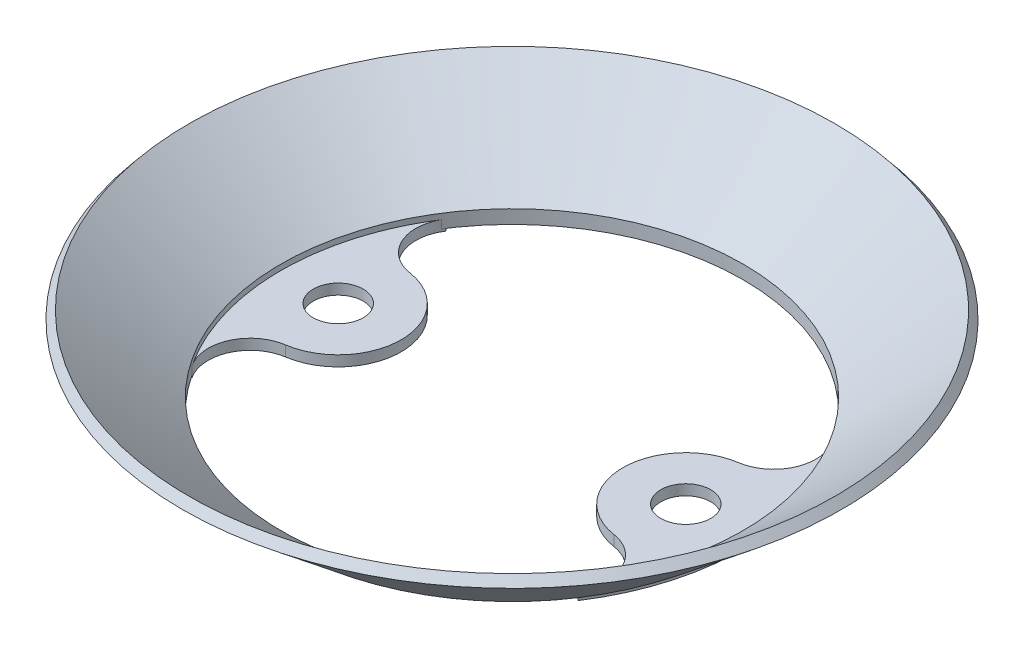
ISO-10303-21;
HEADER;
FILE_DESCRIPTION(('STEP AP214'),'2;1');
FILE_NAME('part.step','',(''),(''),'','','');
FILE_SCHEMA(('AUTOMOTIVE_DESIGN { 1 0 10303 214 1 1 1 1 }'));
ENDSEC;
DATA;
#1=APPLICATION_CONTEXT('core data for automotive mechanical design processes');
#2=APPLICATION_PROTOCOL_DEFINITION('international standard','automotive_design',2000,#1);
#3=PRODUCT_CONTEXT('',#1,'mechanical');
#4=PRODUCT('Part','Part','',(#3));
#5=PRODUCT_RELATED_PRODUCT_CATEGORY('part','',(#4));
#6=PRODUCT_DEFINITION_FORMATION('','',#4);
#7=PRODUCT_DEFINITION_CONTEXT('part definition',#1,'design');
#8=PRODUCT_DEFINITION('design','',#6,#7);
#9=PRODUCT_DEFINITION_SHAPE('','',#8);
#10=(LENGTH_UNIT() NAMED_UNIT(*) SI_UNIT(.MILLI.,.METRE.));
#11=(NAMED_UNIT(*) PLANE_ANGLE_UNIT() SI_UNIT($,.RADIAN.));
#12=(NAMED_UNIT(*) SI_UNIT($,.STERADIAN.) SOLID_ANGLE_UNIT());
#13=UNCERTAINTY_MEASURE_WITH_UNIT(LENGTH_MEASURE(1.E-05),#10,'distance_accuracy_value','');
#14=(GEOMETRIC_REPRESENTATION_CONTEXT(3) GLOBAL_UNCERTAINTY_ASSIGNED_CONTEXT((#13)) GLOBAL_UNIT_ASSIGNED_CONTEXT((#10,
#11,#12)) REPRESENTATION_CONTEXT('',''));
#15=CARTESIAN_POINT('',(0.,0.,0.));
#16=DIRECTION('',(0.,0.,1.));
#17=DIRECTION('',(1.,0.,0.));
#18=AXIS2_PLACEMENT_3D('',#15,#16,#17);
#19=CARTESIAN_POINT('',(15.0423716012085,-1.,9.88569960150304));
#20=DIRECTION('',(0.,1.,0.));
#21=DIRECTION('',(0.,0.,1.));
#22=AXIS2_PLACEMENT_3D('',#19,#20,#21);
#23=CYLINDRICAL_SURFACE('',#22,4.);
#24=CARTESIAN_POINT('',(15.0423716012085,0.,9.88569960150304));
#25=DIRECTION('',(0.,1.,0.));
#26=DIRECTION('',(0.,0.,1.));
#27=AXIS2_PLACEMENT_3D('',#24,#25,#26);
#28=CIRCLE('',#27,4.);
#29=CARTESIAN_POINT('',(15.6454229607251,0.,5.93141976090182));
#30=VERTEX_POINT('',#29);
#31=CARTESIAN_POINT('',(18.3851208459215,0.,12.0825217351704));
#32=VERTEX_POINT('',#31);
#33=EDGE_CURVE('E114',#30,#32,#28,.F.);
#34=ORIENTED_EDGE('',*,*,#33,.F.);
#35=DIRECTION('',(0.,1.,0.));
#36=VECTOR('',#35,1.);
#37=CARTESIAN_POINT('',(15.6454229607251,-1.,5.93141976090182));
#38=LINE('',#37,#36);
#39=CARTESIAN_POINT('',(15.6454229607251,-1.,5.93141976090182));
#40=VERTEX_POINT('',#39);
#41=EDGE_CURVE('E12',#40,#30,#38,.T.);
#42=ORIENTED_EDGE('',*,*,#41,.F.);
#43=CARTESIAN_POINT('',(15.0423716012085,-1.,9.88569960150304));
#44=DIRECTION('',(0.,1.,0.));
#45=DIRECTION('',(0.,0.,1.));
#46=AXIS2_PLACEMENT_3D('',#43,#44,#45);
#47=CIRCLE('',#46,4.);
#48=CARTESIAN_POINT('',(18.3851208459215,-1.,12.0825217351704));
#49=VERTEX_POINT('',#48);
#50=EDGE_CURVE('E104',#40,#49,#47,.F.);
#51=ORIENTED_EDGE('',*,*,#50,.T.);
#52=DIRECTION('',(0.,1.,0.));
#53=VECTOR('',#52,1.);
#54=CARTESIAN_POINT('',(18.3851208459215,-1.,12.0825217351704));
#55=LINE('',#54,#53);
#56=EDGE_CURVE('E49',#49,#32,#55,.T.);
#57=ORIENTED_EDGE('',*,*,#56,.T.);
#58=EDGE_LOOP('',(#34,#42,#51,#57));
#59=FACE_BOUND('',#58,.T.);
#60=ADVANCED_FACE('F45',(#59),#23,.F.);
#61=CARTESIAN_POINT('',(16.55,-1.,0.));
#62=DIRECTION('',(0.,1.,0.));
#63=DIRECTION('',(0.,0.,1.));
#64=AXIS2_PLACEMENT_3D('',#61,#62,#63);
#65=CYLINDRICAL_SURFACE('',#64,6.);
#66=CARTESIAN_POINT('',(16.55,0.,0.));
#67=DIRECTION('',(0.,1.,0.));
#68=DIRECTION('',(0.,0.,1.));
#69=AXIS2_PLACEMENT_3D('',#66,#67,#68);
#70=CIRCLE('',#69,6.);
#71=CARTESIAN_POINT('',(15.6454229607251,0.,-5.93141976090181));
#72=VERTEX_POINT('',#71);
#73=EDGE_CURVE('E120',#72,#30,#70,.T.);
#74=ORIENTED_EDGE('',*,*,#73,.F.);
#75=DIRECTION('',(0.,1.,0.));
#76=VECTOR('',#75,1.);
#77=CARTESIAN_POINT('',(15.6454229607251,-1.,-5.93141976090181));
#78=LINE('',#77,#76);
#79=CARTESIAN_POINT('',(15.6454229607251,-1.,-5.93141976090181));
#80=VERTEX_POINT('',#79);
#81=EDGE_CURVE('E55',#80,#72,#78,.T.);
#82=ORIENTED_EDGE('',*,*,#81,.F.);
#83=CARTESIAN_POINT('',(16.55,-1.,0.));
#84=DIRECTION('',(0.,1.,0.));
#85=DIRECTION('',(0.,0.,1.));
#86=AXIS2_PLACEMENT_3D('',#83,#84,#85);
#87=CIRCLE('',#86,6.);
#88=EDGE_CURVE('E97',#80,#40,#87,.T.);
#89=ORIENTED_EDGE('',*,*,#88,.T.);
#90=ORIENTED_EDGE('',*,*,#41,.T.);
#91=EDGE_LOOP('',(#74,#82,#89,#90));
#92=FACE_BOUND('',#91,.T.);
#93=ADVANCED_FACE('F140',(#92),#65,.T.);
#94=CARTESIAN_POINT('',(15.0423716012085,-1.,-9.88569960150303));
#95=DIRECTION('',(0.,1.,0.));
#96=DIRECTION('',(0.,0.,1.));
#97=AXIS2_PLACEMENT_3D('',#94,#95,#96);
#98=CYLINDRICAL_SURFACE('',#97,4.);
#99=CARTESIAN_POINT('',(15.0423716012085,0.,-9.88569960150303));
#100=DIRECTION('',(0.,1.,0.));
#101=DIRECTION('',(0.,0.,1.));
#102=AXIS2_PLACEMENT_3D('',#99,#100,#101);
#103=CIRCLE('',#102,4.);
#104=CARTESIAN_POINT('',(18.3851208459214,0.,-12.0825217351704));
#105=VERTEX_POINT('',#104);
#106=EDGE_CURVE('E101',#72,#105,#103,.T.);
#107=ORIENTED_EDGE('',*,*,#106,.T.);
#108=DIRECTION('',(0.,1.,0.));
#109=VECTOR('',#108,1.);
#110=CARTESIAN_POINT('',(18.3851208459214,-1.,-12.0825217351704));
#111=LINE('',#110,#109);
#112=CARTESIAN_POINT('',(18.3851208459214,-1.,-12.0825217351704));
#113=VERTEX_POINT('',#112);
#114=EDGE_CURVE('E99',#113,#105,#111,.T.);
#115=ORIENTED_EDGE('',*,*,#114,.F.);
#116=CARTESIAN_POINT('',(15.0423716012085,-1.,-9.88569960150303));
#117=DIRECTION('',(0.,1.,0.));
#118=DIRECTION('',(0.,0.,1.));
#119=AXIS2_PLACEMENT_3D('',#116,#117,#118);
#120=CIRCLE('',#119,4.);
#121=EDGE_CURVE('E93',#80,#113,#120,.T.);
#122=ORIENTED_EDGE('',*,*,#121,.F.);
#123=ORIENTED_EDGE('',*,*,#81,.T.);
#124=EDGE_LOOP('',(#107,#115,#122,#123));
#125=FACE_BOUND('',#124,.T.);
#126=ADVANCED_FACE('F100',(#125),#98,.F.);
#127=CARTESIAN_POINT('',(16.55,-1.,0.));
#128=DIRECTION('',(0.,1.,0.));
#129=DIRECTION('',(0.,0.,1.));
#130=AXIS2_PLACEMENT_3D('',#127,#128,#129);
#131=CYLINDRICAL_SURFACE('',#130,2.375);
#132=CARTESIAN_POINT('',(16.55,-1.,0.));
#133=DIRECTION('',(0.,1.,0.));
#134=DIRECTION('',(0.,0.,1.));
#135=AXIS2_PLACEMENT_3D('',#132,#133,#134);
#136=CIRCLE('',#135,2.375);
#137=CARTESIAN_POINT('',(16.55,-1.,2.37500000000001));
#138=VERTEX_POINT('',#137);
#139=EDGE_CURVE('E106',#138,#138,#136,.F.);
#140=ORIENTED_EDGE('',*,*,#139,.T.);
#141=EDGE_LOOP('',(#140));
#142=FACE_BOUND('',#141,.T.);
#143=CARTESIAN_POINT('',(16.55,0.,0.));
#144=DIRECTION('',(0.,1.,0.));
#145=DIRECTION('',(0.,0.,1.));
#146=AXIS2_PLACEMENT_3D('',#143,#144,#145);
#147=CIRCLE('',#146,2.375);
#148=CARTESIAN_POINT('',(16.55,0.,2.37500000000001));
#149=VERTEX_POINT('',#148);
#150=EDGE_CURVE('E111',#149,#149,#147,.F.);
#151=ORIENTED_EDGE('',*,*,#150,.F.);
#152=EDGE_LOOP('',(#151));
#153=FACE_BOUND('',#152,.T.);
#154=ADVANCED_FACE('F47',(#142,#153),#131,.F.);
#155=CARTESIAN_POINT('',(0.,-1.,0.));
#156=DIRECTION('',(0.,1.,0.));
#157=DIRECTION('',(0.,0.,1.));
#158=AXIS2_PLACEMENT_3D('',#155,#156,#157);
#159=CYLINDRICAL_SURFACE('',#158,22.);
#160=CARTESIAN_POINT('',(0.,0.,0.));
#161=DIRECTION('',(0.,1.,0.));
#162=DIRECTION('',(0.,0.,1.));
#163=AXIS2_PLACEMENT_3D('',#160,#161,#162);
#164=CIRCLE('',#163,22.);
#165=EDGE_CURVE('E117',#32,#105,#164,.T.);
#166=ORIENTED_EDGE('',*,*,#165,.F.);
#167=ORIENTED_EDGE('',*,*,#56,.F.);
#168=CARTESIAN_POINT('',(0.,-1.,0.));
#169=DIRECTION('',(0.,1.,0.));
#170=DIRECTION('',(0.,0.,1.));
#171=AXIS2_PLACEMENT_3D('',#168,#169,#170);
#172=CIRCLE('',#171,22.);
#173=EDGE_CURVE('E96',#49,#113,#172,.T.);
#174=ORIENTED_EDGE('',*,*,#173,.T.);
#175=ORIENTED_EDGE('',*,*,#114,.T.);
#176=EDGE_LOOP('',(#166,#167,#174,#175));
#177=FACE_BOUND('',#176,.T.);
#178=ADVANCED_FACE('F103',(#177),#159,.T.);
#179=CARTESIAN_POINT('',(0.,-1.,0.));
#180=DIRECTION('',(0.,1.,0.));
#181=DIRECTION('',(0.,0.,1.));
#182=AXIS2_PLACEMENT_3D('',#179,#180,#181);
#183=PLANE('',#182);
#184=ORIENTED_EDGE('',*,*,#139,.F.);
#185=EDGE_LOOP('',(#184));
#186=FACE_BOUND('',#185,.T.);
#187=ORIENTED_EDGE('',*,*,#50,.F.);
#188=ORIENTED_EDGE('',*,*,#88,.F.);
#189=ORIENTED_EDGE('',*,*,#121,.T.);
#190=ORIENTED_EDGE('',*,*,#173,.F.);
#191=EDGE_LOOP('',(#187,#188,#189,#190));
#192=FACE_BOUND('',#191,.T.);
#193=ADVANCED_FACE('F95',(#186,#192),#183,.F.);
#194=CARTESIAN_POINT('',(0.,0.,0.));
#195=DIRECTION('',(0.,1.,0.));
#196=DIRECTION('',(0.,0.,1.));
#197=AXIS2_PLACEMENT_3D('',#194,#195,#196);
#198=PLANE('',#197);
#199=ORIENTED_EDGE('',*,*,#150,.T.);
#200=EDGE_LOOP('',(#199));
#201=FACE_BOUND('',#200,.T.);
#202=ORIENTED_EDGE('',*,*,#33,.T.);
#203=ORIENTED_EDGE('',*,*,#165,.T.);
#204=ORIENTED_EDGE('',*,*,#106,.F.);
#205=ORIENTED_EDGE('',*,*,#73,.T.);
#206=EDGE_LOOP('',(#202,#203,#204,#205));
#207=FACE_BOUND('',#206,.T.);
#208=ADVANCED_FACE('F130',(#201,#207),#198,.T.);
#209=CLOSED_SHELL('',(#60,#93,#126,#154,#178,#193,#208));
#210=MANIFOLD_SOLID_BREP('B2',#209);
#211=CARTESIAN_POINT('',(-15.0423716012085,-1.,-9.88569960150303));
#212=DIRECTION('',(0.,1.,0.));
#213=DIRECTION('',(0.,0.,1.));
#214=AXIS2_PLACEMENT_3D('',#211,#212,#213);
#215=CYLINDRICAL_SURFACE('',#214,4.);
#216=CARTESIAN_POINT('',(-15.0423716012085,0.,-9.88569960150303));
#217=DIRECTION('',(0.,1.,0.));
#218=DIRECTION('',(0.,0.,1.));
#219=AXIS2_PLACEMENT_3D('',#216,#217,#218);
#220=CIRCLE('',#219,4.);
#221=CARTESIAN_POINT('',(-15.6454229607251,0.,-5.93141976090181));
#222=VERTEX_POINT('',#221);
#223=CARTESIAN_POINT('',(-18.3851208459215,0.,-12.0825217351704));
#224=VERTEX_POINT('',#223);
#225=EDGE_CURVE('E267',#222,#224,#220,.F.);
#226=ORIENTED_EDGE('',*,*,#225,.F.);
#227=DIRECTION('',(0.,1.,0.));
#228=VECTOR('',#227,1.);
#229=CARTESIAN_POINT('',(-15.6454229607251,-1.,-5.93141976090181));
#230=LINE('',#229,#228);
#231=CARTESIAN_POINT('',(-15.6454229607251,-1.,-5.93141976090181));
#232=VERTEX_POINT('',#231);
#233=EDGE_CURVE('E43',#232,#222,#230,.T.);
#234=ORIENTED_EDGE('',*,*,#233,.F.);
#235=CARTESIAN_POINT('',(-15.0423716012085,-1.,-9.88569960150303));
#236=DIRECTION('',(0.,1.,0.));
#237=DIRECTION('',(0.,0.,1.));
#238=AXIS2_PLACEMENT_3D('',#235,#236,#237);
#239=CIRCLE('',#238,4.);
#240=CARTESIAN_POINT('',(-18.3851208459215,-1.,-12.0825217351704));
#241=VERTEX_POINT('',#240);
#242=EDGE_CURVE('E257',#232,#241,#239,.F.);
#243=ORIENTED_EDGE('',*,*,#242,.T.);
#244=DIRECTION('',(0.,1.,0.));
#245=VECTOR('',#244,1.);
#246=CARTESIAN_POINT('',(-18.3851208459215,-1.,-12.0825217351704));
#247=LINE('',#246,#245);
#248=EDGE_CURVE('E200',#241,#224,#247,.T.);
#249=ORIENTED_EDGE('',*,*,#248,.T.);
#250=EDGE_LOOP('',(#226,#234,#243,#249));
#251=FACE_BOUND('',#250,.T.);
#252=ADVANCED_FACE('F196',(#251),#215,.F.);
#253=CARTESIAN_POINT('',(-16.55,-1.,0.));
#254=DIRECTION('',(0.,1.,0.));
#255=DIRECTION('',(0.,0.,1.));
#256=AXIS2_PLACEMENT_3D('',#253,#254,#255);
#257=CYLINDRICAL_SURFACE('',#256,6.);
#258=CARTESIAN_POINT('',(-16.55,0.,0.));
#259=DIRECTION('',(0.,1.,0.));
#260=DIRECTION('',(0.,0.,1.));
#261=AXIS2_PLACEMENT_3D('',#258,#259,#260);
#262=CIRCLE('',#261,6.);
#263=CARTESIAN_POINT('',(-15.6454229607251,0.,5.93141976090183));
#264=VERTEX_POINT('',#263);
#265=EDGE_CURVE('E273',#222,#264,#262,.F.);
#266=ORIENTED_EDGE('',*,*,#265,.T.);
#267=DIRECTION('',(0.,1.,0.));
#268=VECTOR('',#267,1.);
#269=CARTESIAN_POINT('',(-15.6454229607251,-1.,5.93141976090183));
#270=LINE('',#269,#268);
#271=CARTESIAN_POINT('',(-15.6454229607251,-1.,5.93141976090183));
#272=VERTEX_POINT('',#271);
#273=EDGE_CURVE('E206',#272,#264,#270,.T.);
#274=ORIENTED_EDGE('',*,*,#273,.F.);
#275=CARTESIAN_POINT('',(-16.55,-1.,0.));
#276=DIRECTION('',(0.,1.,0.));
#277=DIRECTION('',(0.,0.,1.));
#278=AXIS2_PLACEMENT_3D('',#275,#276,#277);
#279=CIRCLE('',#278,6.);
#280=EDGE_CURVE('E250',#232,#272,#279,.F.);
#281=ORIENTED_EDGE('',*,*,#280,.F.);
#282=ORIENTED_EDGE('',*,*,#233,.T.);
#283=EDGE_LOOP('',(#266,#274,#281,#282));
#284=FACE_BOUND('',#283,.T.);
#285=ADVANCED_FACE('F275',(#284),#257,.T.);
#286=CARTESIAN_POINT('',(-15.0423716012085,-1.,9.88569960150304));
#287=DIRECTION('',(0.,1.,0.));
#288=DIRECTION('',(0.,0.,1.));
#289=AXIS2_PLACEMENT_3D('',#286,#287,#288);
#290=CYLINDRICAL_SURFACE('',#289,4.);
#291=CARTESIAN_POINT('',(-15.0423716012085,0.,9.88569960150304));
#292=DIRECTION('',(0.,1.,0.));
#293=DIRECTION('',(0.,0.,1.));
#294=AXIS2_PLACEMENT_3D('',#291,#292,#293);
#295=CIRCLE('',#294,4.);
#296=CARTESIAN_POINT('',(-18.3851208459215,0.,12.0825217351704));
#297=VERTEX_POINT('',#296);
#298=EDGE_CURVE('E231',#264,#297,#295,.T.);
#299=ORIENTED_EDGE('',*,*,#298,.T.);
#300=DIRECTION('',(0.,1.,0.));
#301=VECTOR('',#300,1.);
#302=CARTESIAN_POINT('',(-18.3851208459215,-1.,12.0825217351704));
#303=LINE('',#302,#301);
#304=CARTESIAN_POINT('',(-18.3851208459215,-1.,12.0825217351704));
#305=VERTEX_POINT('',#304);
#306=EDGE_CURVE('E254',#305,#297,#303,.T.);
#307=ORIENTED_EDGE('',*,*,#306,.F.);
#308=CARTESIAN_POINT('',(-15.0423716012085,-1.,9.88569960150304));
#309=DIRECTION('',(0.,1.,0.));
#310=DIRECTION('',(0.,0.,1.));
#311=AXIS2_PLACEMENT_3D('',#308,#309,#310);
#312=CIRCLE('',#311,4.);
#313=EDGE_CURVE('E245',#272,#305,#312,.T.);
#314=ORIENTED_EDGE('',*,*,#313,.F.);
#315=ORIENTED_EDGE('',*,*,#273,.T.);
#316=EDGE_LOOP('',(#299,#307,#314,#315));
#317=FACE_BOUND('',#316,.T.);
#318=ADVANCED_FACE('F255',(#317),#290,.F.);
#319=CARTESIAN_POINT('',(-16.55,-1.,0.));
#320=DIRECTION('',(0.,1.,0.));
#321=DIRECTION('',(0.,0.,1.));
#322=AXIS2_PLACEMENT_3D('',#319,#320,#321);
#323=CYLINDRICAL_SURFACE('',#322,2.375);
#324=CARTESIAN_POINT('',(-16.55,-1.,0.));
#325=DIRECTION('',(0.,1.,0.));
#326=DIRECTION('',(0.,0.,1.));
#327=AXIS2_PLACEMENT_3D('',#324,#325,#326);
#328=CIRCLE('',#327,2.375);
#329=CARTESIAN_POINT('',(-16.55,-1.,2.37500000000001));
#330=VERTEX_POINT('',#329);
#331=EDGE_CURVE('E259',#330,#330,#328,.T.);
#332=ORIENTED_EDGE('',*,*,#331,.F.);
#333=EDGE_LOOP('',(#332));
#334=FACE_BOUND('',#333,.T.);
#335=CARTESIAN_POINT('',(-16.55,0.,0.));
#336=DIRECTION('',(0.,1.,0.));
#337=DIRECTION('',(0.,0.,1.));
#338=AXIS2_PLACEMENT_3D('',#335,#336,#337);
#339=CIRCLE('',#338,2.375);
#340=CARTESIAN_POINT('',(-16.55,0.,2.37500000000001));
#341=VERTEX_POINT('',#340);
#342=EDGE_CURVE('E264',#341,#341,#339,.T.);
#343=ORIENTED_EDGE('',*,*,#342,.T.);
#344=EDGE_LOOP('',(#343));
#345=FACE_BOUND('',#344,.T.);
#346=ADVANCED_FACE('F198',(#334,#345),#323,.F.);
#347=CARTESIAN_POINT('',(0.,-1.,0.));
#348=DIRECTION('',(0.,1.,0.));
#349=DIRECTION('',(0.,0.,1.));
#350=AXIS2_PLACEMENT_3D('',#347,#348,#349);
#351=CYLINDRICAL_SURFACE('',#350,22.);
#352=CARTESIAN_POINT('',(0.,0.,0.));
#353=DIRECTION('',(0.,1.,0.));
#354=DIRECTION('',(0.,0.,1.));
#355=AXIS2_PLACEMENT_3D('',#352,#353,#354);
#356=CIRCLE('',#355,22.);
#357=EDGE_CURVE('E270',#224,#297,#356,.T.);
#358=ORIENTED_EDGE('',*,*,#357,.F.);
#359=ORIENTED_EDGE('',*,*,#248,.F.);
#360=CARTESIAN_POINT('',(0.,-1.,0.));
#361=DIRECTION('',(0.,1.,0.));
#362=DIRECTION('',(0.,0.,1.));
#363=AXIS2_PLACEMENT_3D('',#360,#361,#362);
#364=CIRCLE('',#363,22.);
#365=EDGE_CURVE('E249',#241,#305,#364,.T.);
#366=ORIENTED_EDGE('',*,*,#365,.T.);
#367=ORIENTED_EDGE('',*,*,#306,.T.);
#368=EDGE_LOOP('',(#358,#359,#366,#367));
#369=FACE_BOUND('',#368,.T.);
#370=ADVANCED_FACE('F256',(#369),#351,.T.);
#371=CARTESIAN_POINT('',(0.,-1.,0.));
#372=DIRECTION('',(0.,1.,0.));
#373=DIRECTION('',(0.,0.,1.));
#374=AXIS2_PLACEMENT_3D('',#371,#372,#373);
#375=PLANE('',#374);
#376=ORIENTED_EDGE('',*,*,#331,.T.);
#377=EDGE_LOOP('',(#376));
#378=FACE_BOUND('',#377,.T.);
#379=ORIENTED_EDGE('',*,*,#242,.F.);
#380=ORIENTED_EDGE('',*,*,#280,.T.);
#381=ORIENTED_EDGE('',*,*,#313,.T.);
#382=ORIENTED_EDGE('',*,*,#365,.F.);
#383=EDGE_LOOP('',(#379,#380,#381,#382));
#384=FACE_BOUND('',#383,.T.);
#385=ADVANCED_FACE('F248',(#378,#384),#375,.F.);
#386=CARTESIAN_POINT('',(0.,0.,0.));
#387=DIRECTION('',(0.,1.,0.));
#388=DIRECTION('',(0.,0.,1.));
#389=AXIS2_PLACEMENT_3D('',#386,#387,#388);
#390=PLANE('',#389);
#391=ORIENTED_EDGE('',*,*,#342,.F.);
#392=EDGE_LOOP('',(#391));
#393=FACE_BOUND('',#392,.T.);
#394=ORIENTED_EDGE('',*,*,#225,.T.);
#395=ORIENTED_EDGE('',*,*,#357,.T.);
#396=ORIENTED_EDGE('',*,*,#298,.F.);
#397=ORIENTED_EDGE('',*,*,#265,.F.);
#398=EDGE_LOOP('',(#394,#395,#396,#397));
#399=FACE_BOUND('',#398,.T.);
#400=ADVANCED_FACE('F276',(#393,#399),#390,.T.);
#401=CLOSED_SHELL('',(#252,#285,#318,#346,#370,#385,#400));
#402=MANIFOLD_SOLID_BREP('B6',#401);
#403=CARTESIAN_POINT('',(0.,0.,0.));
#404=DIRECTION('',(0.,-1.,0.));
#405=DIRECTION('',(0.,0.,-1.));
#406=AXIS2_PLACEMENT_3D('',#403,#404,#405);
#407=CYLINDRICAL_SURFACE('',#406,22.);
#408=CARTESIAN_POINT('',(0.,0.528140096118482,0.));
#409=DIRECTION('',(0.,-1.,0.));
#410=DIRECTION('',(0.,0.,-1.));
#411=AXIS2_PLACEMENT_3D('',#408,#409,#410);
#412=CIRCLE('',#411,22.);
#413=CARTESIAN_POINT('',(0.,0.528140096118482,-22.));
#414=VERTEX_POINT('',#413);
#415=EDGE_CURVE('E354',#414,#414,#412,.T.);
#416=ORIENTED_EDGE('',*,*,#415,.F.);
#417=EDGE_LOOP('',(#416));
#418=FACE_BOUND('',#417,.T.);
#419=CARTESIAN_POINT('',(0.,-0.767223260548466,0.));
#420=DIRECTION('',(0.,-1.,0.));
#421=DIRECTION('',(0.,0.,-1.));
#422=AXIS2_PLACEMENT_3D('',#419,#420,#421);
#423=CIRCLE('',#422,22.);
#424=CARTESIAN_POINT('',(0.,-0.767223260548466,-22.));
#425=VERTEX_POINT('',#424);
#426=EDGE_CURVE('E195',#425,#425,#423,.T.);
#427=ORIENTED_EDGE('',*,*,#426,.T.);
#428=EDGE_LOOP('',(#427));
#429=FACE_BOUND('',#428,.T.);
#430=ADVANCED_FACE('F340',(#418,#429),#407,.F.);
#431=CARTESIAN_POINT('',(0.,6.96079257388652,0.));
#432=DIRECTION('',(0.,1.,0.));
#433=DIRECTION('',(0.,0.,1.));
#434=AXIS2_PLACEMENT_3D('',#431,#432,#433);
#435=CONICAL_SURFACE('',#434,31.3856417608346,0.881956777514663);
#436=ORIENTED_EDGE('',*,*,#426,.F.);
#437=EDGE_LOOP('',(#436));
#438=FACE_BOUND('',#437,.T.);
#439=CARTESIAN_POINT('',(0.,6.96079257388652,0.));
#440=DIRECTION('',(0.,-1.,0.));
#441=DIRECTION('',(0.,0.,-1.));
#442=AXIS2_PLACEMENT_3D('',#439,#440,#441);
#443=CIRCLE('',#442,31.3856417608346);
#444=CARTESIAN_POINT('',(0.,6.96079257388652,-31.3856417608346));
#445=VERTEX_POINT('',#444);
#446=EDGE_CURVE('E346',#445,#445,#443,.T.);
#447=ORIENTED_EDGE('',*,*,#446,.T.);
#448=EDGE_LOOP('',(#447));
#449=FACE_BOUND('',#448,.T.);
#450=ADVANCED_FACE('F363',(#438,#449),#435,.T.);
#451=CARTESIAN_POINT('',(0.,7.73277673945153,0.));
#452=DIRECTION('',(0.,-1.,0.));
#453=DIRECTION('',(0.,0.,-1.));
#454=AXIS2_PLACEMENT_3D('',#451,#452,#453);
#455=CONICAL_SURFACE('',#454,30.75,0.688839549280229);
#456=ORIENTED_EDGE('',*,*,#446,.F.);
#457=EDGE_LOOP('',(#456));
#458=FACE_BOUND('',#457,.T.);
#459=CARTESIAN_POINT('',(0.,7.73277673945153,0.));
#460=DIRECTION('',(0.,-1.,0.));
#461=DIRECTION('',(0.,0.,-1.));
#462=AXIS2_PLACEMENT_3D('',#459,#460,#461);
#463=CIRCLE('',#462,30.75);
#464=CARTESIAN_POINT('',(0.,7.73277673945153,-30.75));
#465=VERTEX_POINT('',#464);
#466=EDGE_CURVE('E350',#465,#465,#463,.T.);
#467=ORIENTED_EDGE('',*,*,#466,.T.);
#468=EDGE_LOOP('',(#467));
#469=FACE_BOUND('',#468,.T.);
#470=ADVANCED_FACE('F367',(#458,#469),#455,.T.);
#471=CARTESIAN_POINT('',(0.,0.528140096118482,0.));
#472=DIRECTION('',(0.,1.,0.));
#473=DIRECTION('',(0.,0.,1.));
#474=AXIS2_PLACEMENT_3D('',#471,#472,#473);
#475=CONICAL_SURFACE('',#474,22.,0.881956777514666);
#476=ORIENTED_EDGE('',*,*,#466,.F.);
#477=EDGE_LOOP('',(#476));
#478=FACE_BOUND('',#477,.T.);
#479=ORIENTED_EDGE('',*,*,#415,.T.);
#480=EDGE_LOOP('',(#479));
#481=FACE_BOUND('',#480,.T.);
#482=ADVANCED_FACE('F360',(#478,#481),#475,.F.);
#483=CLOSED_SHELL('',(#430,#450,#470,#482));
#484=MANIFOLD_SOLID_BREP('B37',#483);
#485=ADVANCED_BREP_SHAPE_REPRESENTATION('',(#18,#210,#402,#484),#14);
#486=SHAPE_DEFINITION_REPRESENTATION(#9,#485);
ENDSEC;
END-ISO-10303-21;
